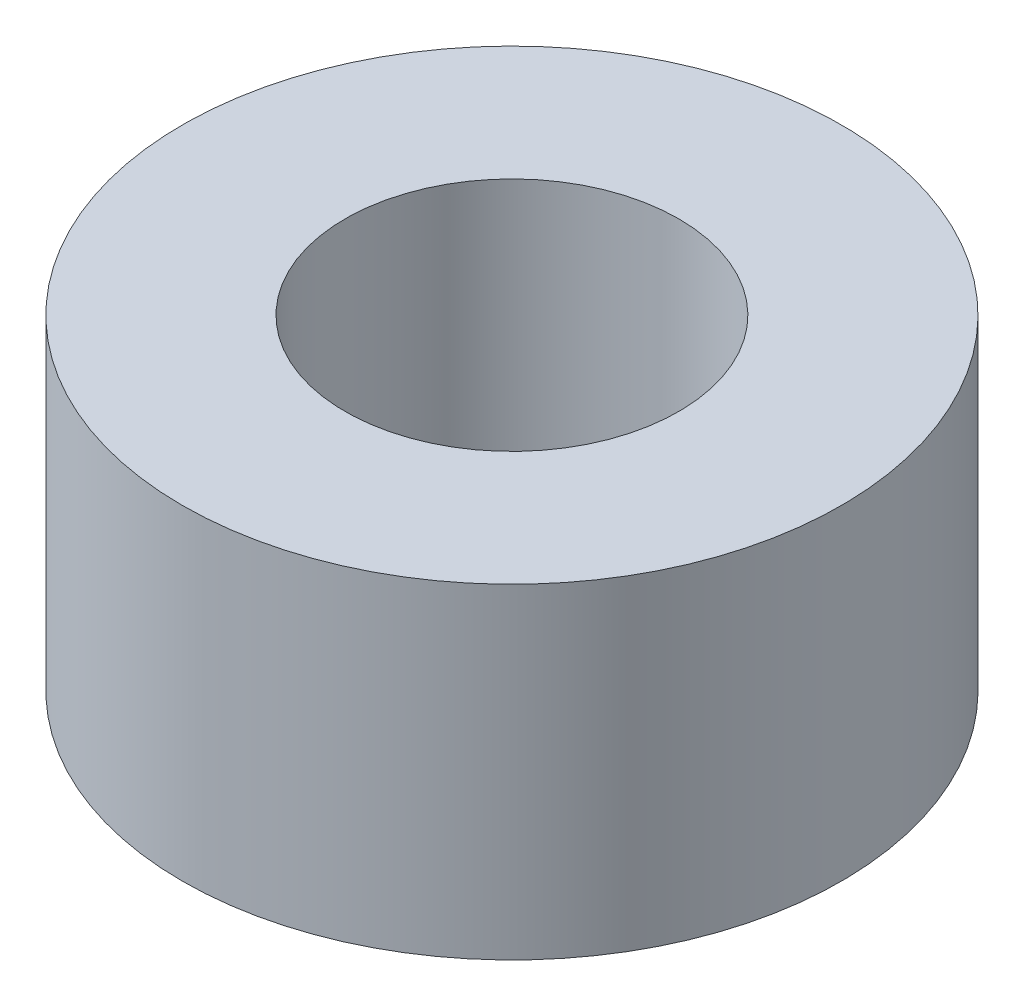
ISO-10303-21;
HEADER;
FILE_DESCRIPTION(('STEP AP214'),'2;1');
FILE_NAME('part.step','',(''),(''),'','','');
FILE_SCHEMA(('AUTOMOTIVE_DESIGN { 1 0 10303 214 1 1 1 1 }'));
ENDSEC;
DATA;
#1=APPLICATION_CONTEXT('core data for automotive mechanical design processes');
#2=APPLICATION_PROTOCOL_DEFINITION('international standard','automotive_design',2000,#1);
#3=PRODUCT_CONTEXT('',#1,'mechanical');
#4=PRODUCT('Part','Part','',(#3));
#5=PRODUCT_RELATED_PRODUCT_CATEGORY('part','',(#4));
#6=PRODUCT_DEFINITION_FORMATION('','',#4);
#7=PRODUCT_DEFINITION_CONTEXT('part definition',#1,'design');
#8=PRODUCT_DEFINITION('design','',#6,#7);
#9=PRODUCT_DEFINITION_SHAPE('','',#8);
#10=(LENGTH_UNIT() NAMED_UNIT(*) SI_UNIT(.MILLI.,.METRE.));
#11=(NAMED_UNIT(*) PLANE_ANGLE_UNIT() SI_UNIT($,.RADIAN.));
#12=(NAMED_UNIT(*) SI_UNIT($,.STERADIAN.) SOLID_ANGLE_UNIT());
#13=UNCERTAINTY_MEASURE_WITH_UNIT(LENGTH_MEASURE(1.E-05),#10,'distance_accuracy_value','');
#14=(GEOMETRIC_REPRESENTATION_CONTEXT(3) GLOBAL_UNCERTAINTY_ASSIGNED_CONTEXT((#13)) GLOBAL_UNIT_ASSIGNED_CONTEXT((#10,
#11,#12)) REPRESENTATION_CONTEXT('',''));
#15=CARTESIAN_POINT('',(0.,0.,0.));
#16=DIRECTION('',(0.,0.,1.));
#17=DIRECTION('',(1.,0.,0.));
#18=AXIS2_PLACEMENT_3D('',#15,#16,#17);
#19=CARTESIAN_POINT('',(0.,3.9,0.));
#20=DIRECTION('',(0.,-1.,0.));
#21=DIRECTION('',(0.,0.,-1.));
#22=AXIS2_PLACEMENT_3D('',#19,#20,#21);
#23=CYLINDRICAL_SURFACE('',#22,3.95);
#24=CARTESIAN_POINT('',(0.,3.9,0.));
#25=DIRECTION('',(0.,1.,0.));
#26=DIRECTION('',(0.,0.,1.));
#27=AXIS2_PLACEMENT_3D('',#24,#25,#26);
#28=CIRCLE('',#27,3.95);
#29=CARTESIAN_POINT('',(0.,3.9,3.95));
#30=VERTEX_POINT('',#29);
#31=EDGE_CURVE('E10',#30,#30,#28,.T.);
#32=ORIENTED_EDGE('',*,*,#31,.F.);
#33=EDGE_LOOP('',(#32));
#34=FACE_BOUND('',#33,.T.);
#35=CARTESIAN_POINT('',(0.,0.,0.));
#36=DIRECTION('',(0.,1.,0.));
#37=DIRECTION('',(0.,0.,1.));
#38=AXIS2_PLACEMENT_3D('',#35,#36,#37);
#39=CIRCLE('',#38,3.95);
#40=CARTESIAN_POINT('',(0.,0.,3.95));
#41=VERTEX_POINT('',#40);
#42=EDGE_CURVE('E34',#41,#41,#39,.T.);
#43=ORIENTED_EDGE('',*,*,#42,.T.);
#44=EDGE_LOOP('',(#43));
#45=FACE_BOUND('',#44,.T.);
#46=ADVANCED_FACE('F31',(#34,#45),#23,.T.);
#47=CARTESIAN_POINT('',(0.,3.9,0.));
#48=DIRECTION('',(0.,1.,0.));
#49=DIRECTION('',(0.,0.,1.));
#50=AXIS2_PLACEMENT_3D('',#47,#48,#49);
#51=PLANE('',#50);
#52=CARTESIAN_POINT('',(0.,3.9,0.));
#53=DIRECTION('',(0.,-1.,0.));
#54=DIRECTION('',(0.,0.,-1.));
#55=AXIS2_PLACEMENT_3D('',#52,#53,#54);
#56=CIRCLE('',#55,2.);
#57=CARTESIAN_POINT('',(0.,3.9,-2.));
#58=VERTEX_POINT('',#57);
#59=EDGE_CURVE('E41',#58,#58,#56,.T.);
#60=ORIENTED_EDGE('',*,*,#59,.T.);
#61=EDGE_LOOP('',(#60));
#62=FACE_BOUND('',#61,.T.);
#63=ORIENTED_EDGE('',*,*,#31,.T.);
#64=EDGE_LOOP('',(#63));
#65=FACE_BOUND('',#64,.T.);
#66=ADVANCED_FACE('F49',(#62,#65),#51,.T.);
#67=CARTESIAN_POINT('',(0.,0.,0.));
#68=DIRECTION('',(0.,1.,0.));
#69=DIRECTION('',(0.,0.,1.));
#70=AXIS2_PLACEMENT_3D('',#67,#68,#69);
#71=PLANE('',#70);
#72=CARTESIAN_POINT('',(0.,0.,0.));
#73=DIRECTION('',(0.,-1.,0.));
#74=DIRECTION('',(0.,0.,-1.));
#75=AXIS2_PLACEMENT_3D('',#72,#73,#74);
#76=CIRCLE('',#75,2.);
#77=CARTESIAN_POINT('',(0.,0.,-2.));
#78=VERTEX_POINT('',#77);
#79=EDGE_CURVE('E43',#78,#78,#76,.T.);
#80=ORIENTED_EDGE('',*,*,#79,.F.);
#81=EDGE_LOOP('',(#80));
#82=FACE_BOUND('',#81,.T.);
#83=ORIENTED_EDGE('',*,*,#42,.F.);
#84=EDGE_LOOP('',(#83));
#85=FACE_BOUND('',#84,.T.);
#86=ADVANCED_FACE('F54',(#82,#85),#71,.F.);
#87=CARTESIAN_POINT('',(0.,3.9,0.));
#88=DIRECTION('',(0.,-1.,0.));
#89=DIRECTION('',(0.,0.,-1.));
#90=AXIS2_PLACEMENT_3D('',#87,#88,#89);
#91=CYLINDRICAL_SURFACE('',#90,2.);
#92=ORIENTED_EDGE('',*,*,#59,.F.);
#93=EDGE_LOOP('',(#92));
#94=FACE_BOUND('',#93,.T.);
#95=ORIENTED_EDGE('',*,*,#79,.T.);
#96=EDGE_LOOP('',(#95));
#97=FACE_BOUND('',#96,.T.);
#98=ADVANCED_FACE('F51',(#94,#97),#91,.F.);
#99=CLOSED_SHELL('',(#46,#66,#86,#98));
#100=MANIFOLD_SOLID_BREP('B2',#99);
#101=ADVANCED_BREP_SHAPE_REPRESENTATION('',(#18,#100),#14);
#102=SHAPE_DEFINITION_REPRESENTATION(#9,#101);
ENDSEC;
END-ISO-10303-21;
